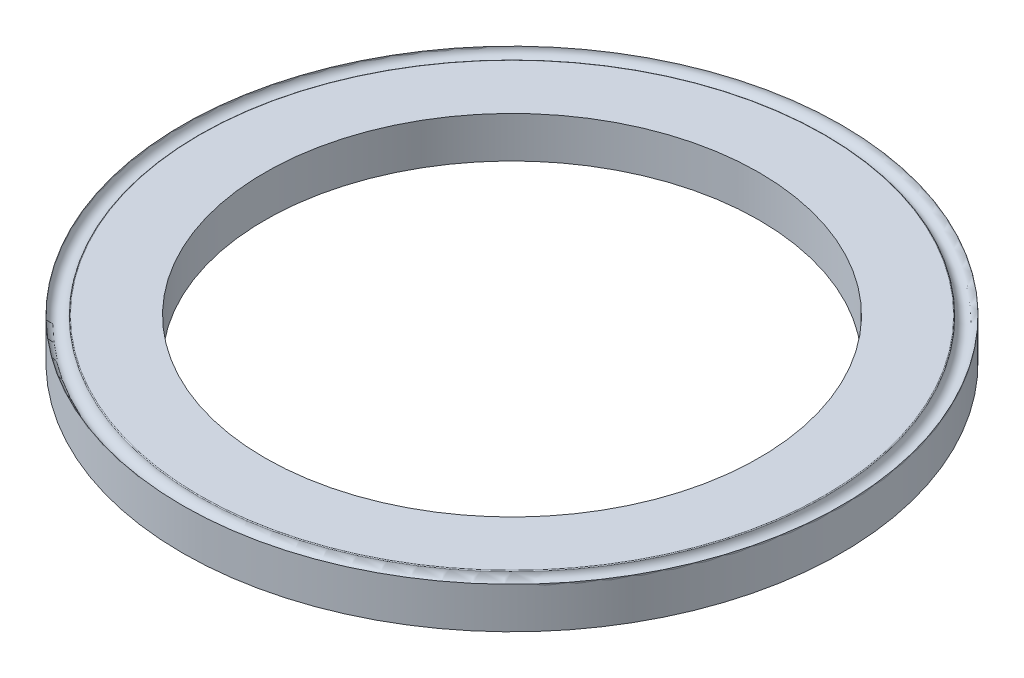
ISO-10303-21;
HEADER;
FILE_DESCRIPTION(('STEP AP214'),'2;1');
FILE_NAME('part.step','',(''),(''),'','','');
FILE_SCHEMA(('AUTOMOTIVE_DESIGN { 1 0 10303 214 1 1 1 1 }'));
ENDSEC;
DATA;
#1=APPLICATION_CONTEXT('core data for automotive mechanical design processes');
#2=APPLICATION_PROTOCOL_DEFINITION('international standard','automotive_design',2000,#1);
#3=PRODUCT_CONTEXT('',#1,'mechanical');
#4=PRODUCT('Part','Part','',(#3));
#5=PRODUCT_RELATED_PRODUCT_CATEGORY('part','',(#4));
#6=PRODUCT_DEFINITION_FORMATION('','',#4);
#7=PRODUCT_DEFINITION_CONTEXT('part definition',#1,'design');
#8=PRODUCT_DEFINITION('design','',#6,#7);
#9=PRODUCT_DEFINITION_SHAPE('','',#8);
#10=(LENGTH_UNIT() NAMED_UNIT(*) SI_UNIT(.MILLI.,.METRE.));
#11=(NAMED_UNIT(*) PLANE_ANGLE_UNIT() SI_UNIT($,.RADIAN.));
#12=(NAMED_UNIT(*) SI_UNIT($,.STERADIAN.) SOLID_ANGLE_UNIT());
#13=UNCERTAINTY_MEASURE_WITH_UNIT(LENGTH_MEASURE(1.E-05),#10,'distance_accuracy_value','');
#14=(GEOMETRIC_REPRESENTATION_CONTEXT(3) GLOBAL_UNCERTAINTY_ASSIGNED_CONTEXT((#13)) GLOBAL_UNIT_ASSIGNED_CONTEXT((#10,
#11,#12)) REPRESENTATION_CONTEXT('',''));
#15=CARTESIAN_POINT('',(0.,0.,0.));
#16=DIRECTION('',(0.,0.,1.));
#17=DIRECTION('',(1.,0.,0.));
#18=AXIS2_PLACEMENT_3D('',#15,#16,#17);
#19=CARTESIAN_POINT('',(0.,0.25,0.));
#20=DIRECTION('',(0.,1.,0.));
#21=DIRECTION('',(0.,0.,1.));
#22=AXIS2_PLACEMENT_3D('',#19,#20,#21);
#23=PLANE('',#22);
#24=CARTESIAN_POINT('',(0.,0.25,0.));
#25=DIRECTION('',(0.,1.,0.));
#26=DIRECTION('',(0.,0.,1.));
#27=AXIS2_PLACEMENT_3D('',#24,#25,#26);
#28=CIRCLE('',#27,3.79045548849897);
#29=CARTESIAN_POINT('',(0.,0.25,3.79045548849897));
#30=VERTEX_POINT('',#29);
#31=EDGE_CURVE('E66',#30,#30,#28,.T.);
#32=ORIENTED_EDGE('',*,*,#31,.T.);
#33=EDGE_LOOP('',(#32));
#34=FACE_BOUND('',#33,.T.);
#35=CARTESIAN_POINT('',(0.,0.25,0.));
#36=DIRECTION('',(0.,1.,0.));
#37=DIRECTION('',(0.,0.,1.));
#38=AXIS2_PLACEMENT_3D('',#35,#36,#37);
#39=CIRCLE('',#38,3.);
#40=CARTESIAN_POINT('',(0.,0.25,3.));
#41=VERTEX_POINT('',#40);
#42=EDGE_CURVE('E48',#41,#41,#39,.T.);
#43=ORIENTED_EDGE('',*,*,#42,.F.);
#44=EDGE_LOOP('',(#43));
#45=FACE_BOUND('',#44,.T.);
#46=ADVANCED_FACE('F41',(#34,#45),#23,.T.);
#47=CARTESIAN_POINT('',(0.,-0.25,0.));
#48=DIRECTION('',(0.,1.,0.));
#49=DIRECTION('',(0.,0.,1.));
#50=AXIS2_PLACEMENT_3D('',#47,#48,#49);
#51=PLANE('',#50);
#52=CARTESIAN_POINT('',(0.,-0.25,0.));
#53=DIRECTION('',(0.,1.,0.));
#54=DIRECTION('',(0.,0.,1.));
#55=AXIS2_PLACEMENT_3D('',#52,#53,#54);
#56=CIRCLE('',#55,4.);
#57=CARTESIAN_POINT('',(0.,-0.25,4.));
#58=VERTEX_POINT('',#57);
#59=EDGE_CURVE('E10',#58,#58,#56,.T.);
#60=ORIENTED_EDGE('',*,*,#59,.F.);
#61=EDGE_LOOP('',(#60));
#62=FACE_BOUND('',#61,.T.);
#63=CARTESIAN_POINT('',(0.,-0.25,0.));
#64=DIRECTION('',(0.,1.,0.));
#65=DIRECTION('',(0.,0.,1.));
#66=AXIS2_PLACEMENT_3D('',#63,#64,#65);
#67=CIRCLE('',#66,3.);
#68=CARTESIAN_POINT('',(0.,-0.25,3.));
#69=VERTEX_POINT('',#68);
#70=EDGE_CURVE('E53',#69,#69,#67,.T.);
#71=ORIENTED_EDGE('',*,*,#70,.T.);
#72=EDGE_LOOP('',(#71));
#73=FACE_BOUND('',#72,.T.);
#74=ADVANCED_FACE('F86',(#62,#73),#51,.F.);
#75=CARTESIAN_POINT('',(0.,0.25,0.));
#76=DIRECTION('',(0.,-1.,0.));
#77=DIRECTION('',(0.,0.,-1.));
#78=AXIS2_PLACEMENT_3D('',#75,#76,#77);
#79=CYLINDRICAL_SURFACE('',#78,4.);
#80=CARTESIAN_POINT('',(0.,0.25,0.));
#81=DIRECTION('',(0.,1.,0.));
#82=DIRECTION('',(0.,0.,1.));
#83=AXIS2_PLACEMENT_3D('',#80,#81,#82);
#84=CIRCLE('',#83,4.);
#85=CARTESIAN_POINT('',(0.,0.25,4.));
#86=VERTEX_POINT('',#85);
#87=EDGE_CURVE('E63',#86,#86,#84,.T.);
#88=ORIENTED_EDGE('',*,*,#87,.F.);
#89=EDGE_LOOP('',(#88));
#90=FACE_BOUND('',#89,.T.);
#91=ORIENTED_EDGE('',*,*,#59,.T.);
#92=EDGE_LOOP('',(#91));
#93=FACE_BOUND('',#92,.T.);
#94=ADVANCED_FACE('F43',(#90,#93),#79,.T.);
#95=CARTESIAN_POINT('',(0.,0.25,0.));
#96=DIRECTION('',(0.,-1.,0.));
#97=DIRECTION('',(0.,0.,-1.));
#98=AXIS2_PLACEMENT_3D('',#95,#96,#97);
#99=CYLINDRICAL_SURFACE('',#98,3.);
#100=ORIENTED_EDGE('',*,*,#42,.T.);
#101=EDGE_LOOP('',(#100));
#102=FACE_BOUND('',#101,.T.);
#103=ORIENTED_EDGE('',*,*,#70,.F.);
#104=EDGE_LOOP('',(#103));
#105=FACE_BOUND('',#104,.T.);
#106=ADVANCED_FACE('F76',(#102,#105),#99,.F.);
#107=CARTESIAN_POINT('',(0.,0.24,0.));
#108=DIRECTION('',(0.,1.,0.));
#109=DIRECTION('',(0.,0.,1.));
#110=AXIS2_PLACEMENT_3D('',#107,#108,#109);
#111=TOROIDAL_SURFACE('',#110,3.79045548849897,0.01);
#112=ORIENTED_EDGE('',*,*,#31,.F.);
#113=EDGE_LOOP('',(#112));
#114=FACE_BOUND('',#113,.T.);
#115=CARTESIAN_POINT('',(0.,0.240909090909091,0.));
#116=DIRECTION('',(0.,1.,0.));
#117=DIRECTION('',(0.,0.,1.));
#118=AXIS2_PLACEMENT_3D('',#115,#116,#117);
#119=CIRCLE('',#118,3.80041408045361);
#120=CARTESIAN_POINT('',(0.,0.240909090909091,3.80041408045361));
#121=VERTEX_POINT('',#120);
#122=EDGE_CURVE('E59',#121,#121,#119,.T.);
#123=ORIENTED_EDGE('',*,*,#122,.T.);
#124=EDGE_LOOP('',(#123));
#125=FACE_BOUND('',#124,.T.);
#126=ADVANCED_FACE('F72',(#114,#125),#111,.T.);
#127=CARTESIAN_POINT('',(0.,0.25,0.));
#128=DIRECTION('',(0.,1.,0.));
#129=DIRECTION('',(0.,0.,1.));
#130=AXIS2_PLACEMENT_3D('',#127,#128,#129);
#131=TOROIDAL_SURFACE('',#130,3.9,0.1);
#132=ORIENTED_EDGE('',*,*,#122,.F.);
#133=EDGE_LOOP('',(#132));
#134=FACE_BOUND('',#133,.T.);
#135=ORIENTED_EDGE('',*,*,#87,.T.);
#136=EDGE_LOOP('',(#135));
#137=FACE_BOUND('',#136,.T.);
#138=ADVANCED_FACE('F75',(#134,#137),#131,.F.);
#139=CLOSED_SHELL('',(#46,#74,#94,#106,#126,#138));
#140=MANIFOLD_SOLID_BREP('B2',#139);
#141=ADVANCED_BREP_SHAPE_REPRESENTATION('',(#18,#140),#14);
#142=SHAPE_DEFINITION_REPRESENTATION(#9,#141);
ENDSEC;
END-ISO-10303-21;
